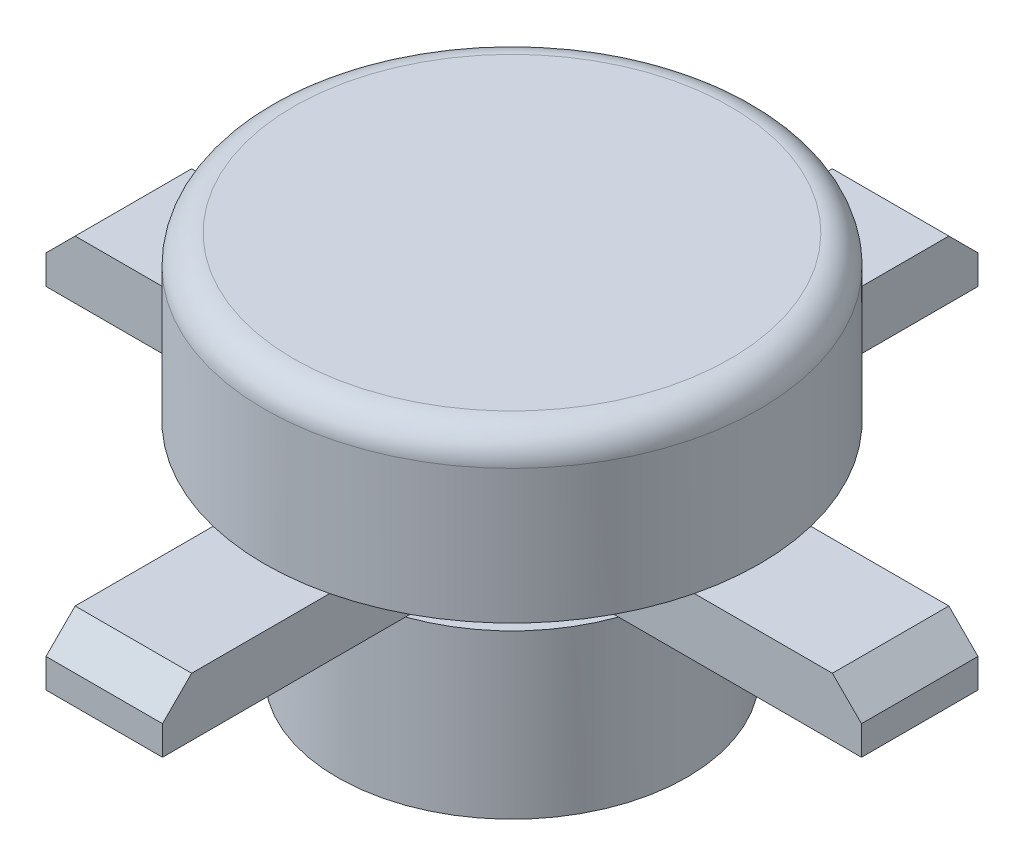
ISO-10303-21;
HEADER;
FILE_DESCRIPTION(('STEP AP214'),'2;1');
FILE_NAME('part.step','',(''),(''),'','','');
FILE_SCHEMA(('AUTOMOTIVE_DESIGN { 1 0 10303 214 1 1 1 1 }'));
ENDSEC;
DATA;
#1=APPLICATION_CONTEXT('core data for automotive mechanical design processes');
#2=APPLICATION_PROTOCOL_DEFINITION('international standard','automotive_design',2000,#1);
#3=PRODUCT_CONTEXT('',#1,'mechanical');
#4=PRODUCT('Part','Part','',(#3));
#5=PRODUCT_RELATED_PRODUCT_CATEGORY('part','',(#4));
#6=PRODUCT_DEFINITION_FORMATION('','',#4);
#7=PRODUCT_DEFINITION_CONTEXT('part definition',#1,'design');
#8=PRODUCT_DEFINITION('design','',#6,#7);
#9=PRODUCT_DEFINITION_SHAPE('','',#8);
#10=(LENGTH_UNIT() NAMED_UNIT(*) SI_UNIT(.MILLI.,.METRE.));
#11=(NAMED_UNIT(*) PLANE_ANGLE_UNIT() SI_UNIT($,.RADIAN.));
#12=(NAMED_UNIT(*) SI_UNIT($,.STERADIAN.) SOLID_ANGLE_UNIT());
#13=UNCERTAINTY_MEASURE_WITH_UNIT(LENGTH_MEASURE(1.E-05),#10,'distance_accuracy_value','');
#14=(GEOMETRIC_REPRESENTATION_CONTEXT(3) GLOBAL_UNCERTAINTY_ASSIGNED_CONTEXT((#13)) GLOBAL_UNIT_ASSIGNED_CONTEXT((#10,
#11,#12)) REPRESENTATION_CONTEXT('',''));
#15=CARTESIAN_POINT('',(0.,0.,0.));
#16=DIRECTION('',(0.,0.,1.));
#17=DIRECTION('',(1.,0.,0.));
#18=AXIS2_PLACEMENT_3D('',#15,#16,#17);
#19=CARTESIAN_POINT('',(0.,-1.,0.));
#20=DIRECTION('',(0.,-1.,0.));
#21=DIRECTION('',(0.,0.,-1.));
#22=AXIS2_PLACEMENT_3D('',#19,#20,#21);
#23=PLANE('',#22);
#24=CARTESIAN_POINT('',(0.,-1.,0.));
#25=DIRECTION('',(0.,-1.,0.));
#26=DIRECTION('',(0.,0.,-1.));
#27=AXIS2_PLACEMENT_3D('',#24,#25,#26);
#28=CIRCLE('',#27,3.);
#29=CARTESIAN_POINT('',(2.82842712474619,-1.,-1.));
#30=VERTEX_POINT('',#29);
#31=CARTESIAN_POINT('',(2.82842712474619,-1.,1.));
#32=VERTEX_POINT('',#31);
#33=EDGE_CURVE('E11',#30,#32,#28,.T.);
#34=ORIENTED_EDGE('',*,*,#33,.F.);
#35=DIRECTION('',(1.,0.,0.));
#36=VECTOR('',#35,1.);
#37=CARTESIAN_POINT('',(-7.,-1.,-1.));
#38=LINE('',#37,#36);
#39=CARTESIAN_POINT('',(7.,-1.,-1.));
#40=VERTEX_POINT('',#39);
#41=EDGE_CURVE('E260',#30,#40,#38,.T.);
#42=ORIENTED_EDGE('',*,*,#41,.T.);
#43=DIRECTION('',(0.,0.,1.));
#44=VECTOR('',#43,1.);
#45=CARTESIAN_POINT('',(7.,-1.,1.));
#46=LINE('',#45,#44);
#47=CARTESIAN_POINT('',(7.,-1.,1.));
#48=VERTEX_POINT('',#47);
#49=EDGE_CURVE('E252',#40,#48,#46,.T.);
#50=ORIENTED_EDGE('',*,*,#49,.T.);
#51=DIRECTION('',(-1.,0.,0.));
#52=VECTOR('',#51,1.);
#53=CARTESIAN_POINT('',(-7.,-1.,1.));
#54=LINE('',#53,#52);
#55=EDGE_CURVE('E250',#48,#32,#54,.T.);
#56=ORIENTED_EDGE('',*,*,#55,.T.);
#57=EDGE_LOOP('',(#34,#42,#50,#56));
#58=FACE_BOUND('',#57,.T.);
#59=ADVANCED_FACE('F33',(#58),#23,.T.);
#60=CARTESIAN_POINT('',(0.999999999999999,-1.,2.82842712474619));
#61=VERTEX_POINT('',#60);
#62=CARTESIAN_POINT('',(-1.,-1.,2.82842712474619));
#63=VERTEX_POINT('',#62);
#64=EDGE_CURVE('E42',#61,#63,#28,.T.);
#65=ORIENTED_EDGE('',*,*,#64,.F.);
#66=DIRECTION('',(0.,0.,1.));
#67=VECTOR('',#66,1.);
#68=CARTESIAN_POINT('',(0.999999999999999,-1.,7.));
#69=LINE('',#68,#67);
#70=CARTESIAN_POINT('',(0.999999999999999,-1.,7.));
#71=VERTEX_POINT('',#70);
#72=EDGE_CURVE('E212',#61,#71,#69,.T.);
#73=ORIENTED_EDGE('',*,*,#72,.T.);
#74=DIRECTION('',(-1.,0.,0.));
#75=VECTOR('',#74,1.);
#76=CARTESIAN_POINT('',(-1.,-1.,7.));
#77=LINE('',#76,#75);
#78=CARTESIAN_POINT('',(-1.,-1.,7.));
#79=VERTEX_POINT('',#78);
#80=EDGE_CURVE('E209',#71,#79,#77,.T.);
#81=ORIENTED_EDGE('',*,*,#80,.T.);
#82=DIRECTION('',(0.,0.,-1.));
#83=VECTOR('',#82,1.);
#84=CARTESIAN_POINT('',(-1.,-1.,7.));
#85=LINE('',#84,#83);
#86=EDGE_CURVE('E457',#79,#63,#85,.T.);
#87=ORIENTED_EDGE('',*,*,#86,.T.);
#88=EDGE_LOOP('',(#65,#73,#81,#87));
#89=FACE_BOUND('',#88,.T.);
#90=ADVANCED_FACE('F482',(#89),#23,.T.);
#91=CARTESIAN_POINT('',(-2.82842712474619,-1.,1.));
#92=VERTEX_POINT('',#91);
#93=CARTESIAN_POINT('',(-2.82842712474619,-1.,-1.));
#94=VERTEX_POINT('',#93);
#95=EDGE_CURVE('E51',#92,#94,#28,.T.);
#96=ORIENTED_EDGE('',*,*,#95,.F.);
#97=CARTESIAN_POINT('',(-7.,-1.,1.));
#98=VERTEX_POINT('',#97);
#99=EDGE_CURVE('E248',#92,#98,#54,.T.);
#100=ORIENTED_EDGE('',*,*,#99,.T.);
#101=DIRECTION('',(0.,0.,-1.));
#102=VECTOR('',#101,1.);
#103=CARTESIAN_POINT('',(-7.,-1.,1.));
#104=LINE('',#103,#102);
#105=CARTESIAN_POINT('',(-7.,-1.,-1.));
#106=VERTEX_POINT('',#105);
#107=EDGE_CURVE('E256',#98,#106,#104,.T.);
#108=ORIENTED_EDGE('',*,*,#107,.T.);
#109=EDGE_CURVE('E265',#106,#94,#38,.T.);
#110=ORIENTED_EDGE('',*,*,#109,.T.);
#111=EDGE_LOOP('',(#96,#100,#108,#110));
#112=FACE_BOUND('',#111,.T.);
#113=ADVANCED_FACE('F450',(#112),#23,.T.);
#114=CARTESIAN_POINT('',(0.,0.,0.));
#115=DIRECTION('',(0.,1.,0.));
#116=DIRECTION('',(0.,0.,1.));
#117=AXIS2_PLACEMENT_3D('',#114,#115,#116);
#118=PLANE('',#117);
#119=DIRECTION('',(0.,0.,1.));
#120=VECTOR('',#119,1.);
#121=CARTESIAN_POINT('',(0.999999999999999,0.,7.));
#122=LINE('',#121,#120);
#123=CARTESIAN_POINT('',(1.,0.,-4.13067791046458));
#124=VERTEX_POINT('',#123);
#125=CARTESIAN_POINT('',(1.,0.,-1.));
#126=VERTEX_POINT('',#125);
#127=EDGE_CURVE('E357',#124,#126,#122,.T.);
#128=ORIENTED_EDGE('',*,*,#127,.F.);
#129=CARTESIAN_POINT('',(0.,0.,0.));
#130=DIRECTION('',(0.,1.,0.));
#131=DIRECTION('',(0.,0.,1.));
#132=AXIS2_PLACEMENT_3D('',#129,#130,#131);
#133=CIRCLE('',#132,4.25);
#134=CARTESIAN_POINT('',(4.13067791046458,0.,-1.));
#135=VERTEX_POINT('',#134);
#136=EDGE_CURVE('E294',#135,#124,#133,.T.);
#137=ORIENTED_EDGE('',*,*,#136,.F.);
#138=DIRECTION('',(1.,0.,0.));
#139=VECTOR('',#138,1.);
#140=CARTESIAN_POINT('',(-7.,0.,-1.));
#141=LINE('',#140,#139);
#142=EDGE_CURVE('E276',#126,#135,#141,.T.);
#143=ORIENTED_EDGE('',*,*,#142,.F.);
#144=EDGE_LOOP('',(#128,#137,#143));
#145=FACE_BOUND('',#144,.T.);
#146=ADVANCED_FACE('F475',(#145),#118,.F.);
#147=DIRECTION('',(0.,0.,-1.));
#148=VECTOR('',#147,1.);
#149=CARTESIAN_POINT('',(-1.,0.,7.));
#150=LINE('',#149,#148);
#151=CARTESIAN_POINT('',(-1.,0.,-1.));
#152=VERTEX_POINT('',#151);
#153=CARTESIAN_POINT('',(-1.,0.,-4.13067791046458));
#154=VERTEX_POINT('',#153);
#155=EDGE_CURVE('E359',#152,#154,#150,.T.);
#156=ORIENTED_EDGE('',*,*,#155,.F.);
#157=CARTESIAN_POINT('',(-4.13067791046458,0.,-1.));
#158=VERTEX_POINT('',#157);
#159=EDGE_CURVE('E277',#158,#152,#141,.T.);
#160=ORIENTED_EDGE('',*,*,#159,.F.);
#161=EDGE_CURVE('E382',#154,#158,#133,.T.);
#162=ORIENTED_EDGE('',*,*,#161,.F.);
#163=EDGE_LOOP('',(#156,#160,#162));
#164=FACE_BOUND('',#163,.T.);
#165=ADVANCED_FACE('F472',(#164),#118,.F.);
#166=CARTESIAN_POINT('',(1.,0.,0.999999999999999));
#167=VERTEX_POINT('',#166);
#168=CARTESIAN_POINT('',(0.999999999999999,0.,4.13067791046458));
#169=VERTEX_POINT('',#168);
#170=EDGE_CURVE('E362',#167,#169,#122,.T.);
#171=ORIENTED_EDGE('',*,*,#170,.F.);
#172=DIRECTION('',(-1.,0.,0.));
#173=VECTOR('',#172,1.);
#174=CARTESIAN_POINT('',(-7.,0.,1.));
#175=LINE('',#174,#173);
#176=CARTESIAN_POINT('',(4.13067791046458,0.,1.));
#177=VERTEX_POINT('',#176);
#178=EDGE_CURVE('E273',#177,#167,#175,.T.);
#179=ORIENTED_EDGE('',*,*,#178,.F.);
#180=EDGE_CURVE('E289',#169,#177,#133,.T.);
#181=ORIENTED_EDGE('',*,*,#180,.F.);
#182=EDGE_LOOP('',(#171,#179,#181));
#183=FACE_BOUND('',#182,.T.);
#184=ADVANCED_FACE('F378',(#183),#118,.F.);
#185=CARTESIAN_POINT('',(-1.,0.,4.13067791046458));
#186=VERTEX_POINT('',#185);
#187=CARTESIAN_POINT('',(-1.,0.,0.999999999999999));
#188=VERTEX_POINT('',#187);
#189=EDGE_CURVE('E436',#186,#188,#150,.T.);
#190=ORIENTED_EDGE('',*,*,#189,.F.);
#191=CARTESIAN_POINT('',(-4.13067791046458,0.,1.));
#192=VERTEX_POINT('',#191);
#193=EDGE_CURVE('E381',#192,#186,#133,.T.);
#194=ORIENTED_EDGE('',*,*,#193,.F.);
#195=EDGE_CURVE('E272',#188,#192,#175,.T.);
#196=ORIENTED_EDGE('',*,*,#195,.F.);
#197=EDGE_LOOP('',(#190,#194,#196));
#198=FACE_BOUND('',#197,.T.);
#199=ADVANCED_FACE('F435',(#198),#118,.F.);
#200=CARTESIAN_POINT('',(-7.,-1.,1.));
#201=DIRECTION('',(0.,0.,-1.));
#202=DIRECTION('',(-1.,0.,0.));
#203=AXIS2_PLACEMENT_3D('',#200,#201,#202);
#204=PLANE('',#203);
#205=DIRECTION('',(0.,1.,0.));
#206=VECTOR('',#205,1.);
#207=CARTESIAN_POINT('',(7.,-1.,1.));
#208=LINE('',#207,#206);
#209=CARTESIAN_POINT('',(7.,-0.500000000000002,1.));
#210=VERTEX_POINT('',#209);
#211=EDGE_CURVE('E286',#48,#210,#208,.T.);
#212=ORIENTED_EDGE('',*,*,#211,.T.);
#213=DIRECTION('',(0.70710678118655,-0.707106781186545,0.));
#214=VECTOR('',#213,1.);
#215=CARTESIAN_POINT('',(7.,-0.500000000000002,1.));
#216=LINE('',#215,#214);
#217=CARTESIAN_POINT('',(6.5,0.,1.));
#218=VERTEX_POINT('',#217);
#219=EDGE_CURVE('E312',#210,#218,#216,.F.);
#220=ORIENTED_EDGE('',*,*,#219,.T.);
#221=EDGE_CURVE('E268',#218,#177,#175,.T.);
#222=ORIENTED_EDGE('',*,*,#221,.T.);
#223=ORIENTED_EDGE('',*,*,#178,.T.);
#224=DIRECTION('',(0.,1.,0.));
#225=VECTOR('',#224,1.);
#226=CARTESIAN_POINT('',(0.999999999999999,-1.,1.));
#227=LINE('',#226,#225);
#228=CARTESIAN_POINT('',(1.,-1.,0.999999999999999));
#229=VERTEX_POINT('',#228);
#230=EDGE_CURVE('E372',#229,#167,#227,.T.);
#231=ORIENTED_EDGE('',*,*,#230,.F.);
#232=EDGE_CURVE('E247',#32,#229,#54,.T.);
#233=ORIENTED_EDGE('',*,*,#232,.F.);
#234=ORIENTED_EDGE('',*,*,#55,.F.);
#235=EDGE_LOOP('',(#212,#220,#222,#223,#231,#233,#234));
#236=FACE_BOUND('',#235,.T.);
#237=ADVANCED_FACE('F404',(#236),#204,.F.);
#238=CARTESIAN_POINT('',(-6.49999999999999,0.,1.));
#239=VERTEX_POINT('',#238);
#240=EDGE_CURVE('E271',#192,#239,#175,.T.);
#241=ORIENTED_EDGE('',*,*,#240,.T.);
#242=DIRECTION('',(0.70710678118655,0.707106781186545,0.));
#243=VECTOR('',#242,1.);
#244=CARTESIAN_POINT('',(-7.,-0.500000000000002,1.));
#245=LINE('',#244,#243);
#246=CARTESIAN_POINT('',(-7.,-0.500000000000002,1.));
#247=VERTEX_POINT('',#246);
#248=EDGE_CURVE('E325',#239,#247,#245,.F.);
#249=ORIENTED_EDGE('',*,*,#248,.T.);
#250=DIRECTION('',(0.,1.,0.));
#251=VECTOR('',#250,1.);
#252=CARTESIAN_POINT('',(-7.,-1.,1.));
#253=LINE('',#252,#251);
#254=EDGE_CURVE('E283',#98,#247,#253,.T.);
#255=ORIENTED_EDGE('',*,*,#254,.F.);
#256=ORIENTED_EDGE('',*,*,#99,.F.);
#257=CARTESIAN_POINT('',(-1.,-1.,1.));
#258=VERTEX_POINT('',#257);
#259=EDGE_CURVE('E244',#258,#92,#54,.T.);
#260=ORIENTED_EDGE('',*,*,#259,.F.);
#261=DIRECTION('',(0.,-1.,0.));
#262=VECTOR('',#261,1.);
#263=CARTESIAN_POINT('',(-1.,-1.,1.));
#264=LINE('',#263,#262);
#265=EDGE_CURVE('E426',#188,#258,#264,.T.);
#266=ORIENTED_EDGE('',*,*,#265,.F.);
#267=ORIENTED_EDGE('',*,*,#195,.T.);
#268=EDGE_LOOP('',(#241,#249,#255,#256,#260,#266,#267));
#269=FACE_BOUND('',#268,.T.);
#270=ADVANCED_FACE('F423',(#269),#204,.F.);
#271=CARTESIAN_POINT('',(-7.,-1.,-1.));
#272=DIRECTION('',(0.,0.,1.));
#273=DIRECTION('',(1.,0.,0.));
#274=AXIS2_PLACEMENT_3D('',#271,#272,#273);
#275=PLANE('',#274);
#276=CARTESIAN_POINT('',(6.5,0.,-1.));
#277=VERTEX_POINT('',#276);
#278=EDGE_CURVE('E270',#135,#277,#141,.T.);
#279=ORIENTED_EDGE('',*,*,#278,.T.);
#280=DIRECTION('',(-0.70710678118655,0.707106781186545,0.));
#281=VECTOR('',#280,1.);
#282=CARTESIAN_POINT('',(7.,-0.500000000000002,-1.));
#283=LINE('',#282,#281);
#284=CARTESIAN_POINT('',(7.,-0.500000000000002,-1.));
#285=VERTEX_POINT('',#284);
#286=EDGE_CURVE('E316',#277,#285,#283,.F.);
#287=ORIENTED_EDGE('',*,*,#286,.T.);
#288=DIRECTION('',(0.,1.,0.));
#289=VECTOR('',#288,1.);
#290=CARTESIAN_POINT('',(7.,-1.,-1.));
#291=LINE('',#290,#289);
#292=EDGE_CURVE('E267',#40,#285,#291,.T.);
#293=ORIENTED_EDGE('',*,*,#292,.F.);
#294=ORIENTED_EDGE('',*,*,#41,.F.);
#295=CARTESIAN_POINT('',(0.999999999999999,-1.,-1.));
#296=VERTEX_POINT('',#295);
#297=EDGE_CURVE('E230',#296,#30,#38,.T.);
#298=ORIENTED_EDGE('',*,*,#297,.F.);
#299=DIRECTION('',(0.,-1.,0.));
#300=VECTOR('',#299,1.);
#301=CARTESIAN_POINT('',(1.,-1.,-1.));
#302=LINE('',#301,#300);
#303=EDGE_CURVE('E217',#126,#296,#302,.T.);
#304=ORIENTED_EDGE('',*,*,#303,.F.);
#305=ORIENTED_EDGE('',*,*,#142,.T.);
#306=EDGE_LOOP('',(#279,#287,#293,#294,#298,#304,#305));
#307=FACE_BOUND('',#306,.T.);
#308=ADVANCED_FACE('F411',(#307),#275,.F.);
#309=DIRECTION('',(0.,1.,0.));
#310=VECTOR('',#309,1.);
#311=CARTESIAN_POINT('',(-7.,-1.,-1.));
#312=LINE('',#311,#310);
#313=CARTESIAN_POINT('',(-7.,-0.500000000000002,-1.));
#314=VERTEX_POINT('',#313);
#315=EDGE_CURVE('E280',#106,#314,#312,.T.);
#316=ORIENTED_EDGE('',*,*,#315,.T.);
#317=DIRECTION('',(-0.70710678118655,-0.707106781186545,0.));
#318=VECTOR('',#317,1.);
#319=CARTESIAN_POINT('',(-7.,-0.500000000000002,-1.));
#320=LINE('',#319,#318);
#321=CARTESIAN_POINT('',(-6.49999999999999,0.,-1.));
#322=VERTEX_POINT('',#321);
#323=EDGE_CURVE('E321',#314,#322,#320,.F.);
#324=ORIENTED_EDGE('',*,*,#323,.T.);
#325=EDGE_CURVE('E274',#322,#158,#141,.T.);
#326=ORIENTED_EDGE('',*,*,#325,.T.);
#327=ORIENTED_EDGE('',*,*,#159,.T.);
#328=DIRECTION('',(0.,1.,0.));
#329=VECTOR('',#328,1.);
#330=CARTESIAN_POINT('',(-1.,-1.,-1.));
#331=LINE('',#330,#329);
#332=CARTESIAN_POINT('',(-1.,-1.,-1.));
#333=VERTEX_POINT('',#332);
#334=EDGE_CURVE('E467',#333,#152,#331,.T.);
#335=ORIENTED_EDGE('',*,*,#334,.F.);
#336=EDGE_CURVE('E264',#94,#333,#38,.T.);
#337=ORIENTED_EDGE('',*,*,#336,.F.);
#338=ORIENTED_EDGE('',*,*,#109,.F.);
#339=EDGE_LOOP('',(#316,#324,#326,#327,#335,#337,#338));
#340=FACE_BOUND('',#339,.T.);
#341=ADVANCED_FACE('F447',(#340),#275,.F.);
#342=CARTESIAN_POINT('',(0.,2.8,0.));
#343=DIRECTION('',(0.,-1.,0.));
#344=DIRECTION('',(0.,0.,-1.));
#345=AXIS2_PLACEMENT_3D('',#342,#343,#344);
#346=CYLINDRICAL_SURFACE('',#345,4.25);
#347=CARTESIAN_POINT('',(0.,2.3,0.));
#348=DIRECTION('',(0.,1.,0.));
#349=DIRECTION('',(0.,0.,1.));
#350=AXIS2_PLACEMENT_3D('',#347,#348,#349);
#351=CIRCLE('',#350,4.25);
#352=CARTESIAN_POINT('',(0.,2.3,4.25));
#353=VERTEX_POINT('',#352);
#354=EDGE_CURVE('E297',#353,#353,#351,.F.);
#355=ORIENTED_EDGE('',*,*,#354,.T.);
#356=EDGE_LOOP('',(#355));
#357=FACE_BOUND('',#356,.T.);
#358=EDGE_CURVE('E290',#177,#135,#133,.T.);
#359=ORIENTED_EDGE('',*,*,#358,.T.);
#360=ORIENTED_EDGE('',*,*,#136,.T.);
#361=CARTESIAN_POINT('',(0.,0.,0.));
#362=DIRECTION('',(0.,-1.,0.));
#363=DIRECTION('',(0.,0.,-1.));
#364=AXIS2_PLACEMENT_3D('',#361,#362,#363);
#365=CIRCLE('',#364,4.25);
#366=EDGE_CURVE('E355',#154,#124,#365,.T.);
#367=ORIENTED_EDGE('',*,*,#366,.F.);
#368=ORIENTED_EDGE('',*,*,#161,.T.);
#369=EDGE_CURVE('E430',#158,#192,#133,.T.);
#370=ORIENTED_EDGE('',*,*,#369,.T.);
#371=ORIENTED_EDGE('',*,*,#193,.T.);
#372=EDGE_CURVE('E385',#169,#186,#365,.T.);
#373=ORIENTED_EDGE('',*,*,#372,.F.);
#374=ORIENTED_EDGE('',*,*,#180,.T.);
#375=EDGE_LOOP('',(#359,#360,#367,#368,#370,#371,#373,#374));
#376=FACE_BOUND('',#375,.T.);
#377=ADVANCED_FACE('F386',(#357,#376),#346,.T.);
#378=CARTESIAN_POINT('',(0.,2.8,0.));
#379=DIRECTION('',(0.,1.,0.));
#380=DIRECTION('',(0.,0.,1.));
#381=AXIS2_PLACEMENT_3D('',#378,#379,#380);
#382=PLANE('',#381);
#383=CARTESIAN_POINT('',(0.,2.8,0.));
#384=DIRECTION('',(0.,1.,0.));
#385=DIRECTION('',(0.,0.,1.));
#386=AXIS2_PLACEMENT_3D('',#383,#384,#385);
#387=CIRCLE('',#386,3.75);
#388=CARTESIAN_POINT('',(0.,2.8,3.75));
#389=VERTEX_POINT('',#388);
#390=EDGE_CURVE('E293',#389,#389,#387,.T.);
#391=ORIENTED_EDGE('',*,*,#390,.T.);
#392=EDGE_LOOP('',(#391));
#393=FACE_BOUND('',#392,.T.);
#394=ADVANCED_FACE('F510',(#393),#382,.T.);
#395=CARTESIAN_POINT('',(0.,2.3,0.));
#396=DIRECTION('',(0.,1.,0.));
#397=DIRECTION('',(0.,0.,1.));
#398=AXIS2_PLACEMENT_3D('',#395,#396,#397);
#399=TOROIDAL_SURFACE('',#398,3.75,0.5);
#400=ORIENTED_EDGE('',*,*,#354,.F.);
#401=EDGE_LOOP('',(#400));
#402=FACE_BOUND('',#401,.T.);
#403=ORIENTED_EDGE('',*,*,#390,.F.);
#404=EDGE_LOOP('',(#403));
#405=FACE_BOUND('',#404,.T.);
#406=ADVANCED_FACE('F512',(#402,#405),#399,.T.);
#407=CARTESIAN_POINT('',(0.,0.,0.));
#408=DIRECTION('',(0.,-1.,0.));
#409=DIRECTION('',(0.,0.,-1.));
#410=AXIS2_PLACEMENT_3D('',#407,#408,#409);
#411=PLANE('',#410);
#412=ORIENTED_EDGE('',*,*,#221,.F.);
#413=DIRECTION('',(0.,0.,-1.));
#414=VECTOR('',#413,1.);
#415=CARTESIAN_POINT('',(6.5,0.,0.));
#416=LINE('',#415,#414);
#417=EDGE_CURVE('E314',#218,#277,#416,.T.);
#418=ORIENTED_EDGE('',*,*,#417,.T.);
#419=ORIENTED_EDGE('',*,*,#278,.F.);
#420=ORIENTED_EDGE('',*,*,#358,.F.);
#421=EDGE_LOOP('',(#412,#418,#419,#420));
#422=FACE_BOUND('',#421,.T.);
#423=ADVANCED_FACE('F418',(#422),#411,.F.);
#424=CARTESIAN_POINT('',(7.,-1.,1.));
#425=DIRECTION('',(-1.,0.,0.));
#426=DIRECTION('',(0.,0.,1.));
#427=AXIS2_PLACEMENT_3D('',#424,#425,#426);
#428=PLANE('',#427);
#429=ORIENTED_EDGE('',*,*,#292,.T.);
#430=DIRECTION('',(0.,0.,1.));
#431=VECTOR('',#430,1.);
#432=CARTESIAN_POINT('',(7.,-0.500000000000002,1.));
#433=LINE('',#432,#431);
#434=EDGE_CURVE('E309',#285,#210,#433,.T.);
#435=ORIENTED_EDGE('',*,*,#434,.T.);
#436=ORIENTED_EDGE('',*,*,#211,.F.);
#437=ORIENTED_EDGE('',*,*,#49,.F.);
#438=EDGE_LOOP('',(#429,#435,#436,#437));
#439=FACE_BOUND('',#438,.T.);
#440=ADVANCED_FACE('F401',(#439),#428,.F.);
#441=CARTESIAN_POINT('',(-7.,-1.,1.));
#442=DIRECTION('',(1.,0.,0.));
#443=DIRECTION('',(0.,0.,-1.));
#444=AXIS2_PLACEMENT_3D('',#441,#442,#443);
#445=PLANE('',#444);
#446=ORIENTED_EDGE('',*,*,#254,.T.);
#447=DIRECTION('',(0.,0.,-1.));
#448=VECTOR('',#447,1.);
#449=CARTESIAN_POINT('',(-7.,-0.500000000000002,1.));
#450=LINE('',#449,#448);
#451=EDGE_CURVE('E318',#247,#314,#450,.T.);
#452=ORIENTED_EDGE('',*,*,#451,.T.);
#453=ORIENTED_EDGE('',*,*,#315,.F.);
#454=ORIENTED_EDGE('',*,*,#107,.F.);
#455=EDGE_LOOP('',(#446,#452,#453,#454));
#456=FACE_BOUND('',#455,.T.);
#457=ADVANCED_FACE('F444',(#456),#445,.F.);
#458=CARTESIAN_POINT('',(-1.,-1.,-2.82842712474619));
#459=VERTEX_POINT('',#458);
#460=CARTESIAN_POINT('',(1.,-1.,-2.82842712474619));
#461=VERTEX_POINT('',#460);
#462=EDGE_CURVE('E202',#459,#461,#28,.T.);
#463=ORIENTED_EDGE('',*,*,#462,.F.);
#464=CARTESIAN_POINT('',(-0.999999999999999,-1.,-7.));
#465=VERTEX_POINT('',#464);
#466=EDGE_CURVE('E455',#459,#465,#85,.T.);
#467=ORIENTED_EDGE('',*,*,#466,.T.);
#468=DIRECTION('',(1.,0.,0.));
#469=VECTOR('',#468,1.);
#470=CARTESIAN_POINT('',(-0.999999999999999,-1.,-7.));
#471=LINE('',#470,#469);
#472=CARTESIAN_POINT('',(1.,-1.,-7.));
#473=VERTEX_POINT('',#472);
#474=EDGE_CURVE('E205',#465,#473,#471,.T.);
#475=ORIENTED_EDGE('',*,*,#474,.T.);
#476=EDGE_CURVE('E198',#473,#461,#69,.T.);
#477=ORIENTED_EDGE('',*,*,#476,.T.);
#478=EDGE_LOOP('',(#463,#467,#475,#477));
#479=FACE_BOUND('',#478,.T.);
#480=ADVANCED_FACE('F200',(#479),#23,.T.);
#481=ORIENTED_EDGE('',*,*,#325,.F.);
#482=DIRECTION('',(0.,0.,1.));
#483=VECTOR('',#482,1.);
#484=CARTESIAN_POINT('',(-6.49999999999999,0.,0.));
#485=LINE('',#484,#483);
#486=EDGE_CURVE('E323',#322,#239,#485,.T.);
#487=ORIENTED_EDGE('',*,*,#486,.T.);
#488=ORIENTED_EDGE('',*,*,#240,.F.);
#489=ORIENTED_EDGE('',*,*,#369,.F.);
#490=EDGE_LOOP('',(#481,#487,#488,#489));
#491=FACE_BOUND('',#490,.T.);
#492=ADVANCED_FACE('F437',(#491),#411,.F.);
#493=CARTESIAN_POINT('',(-0.999999999999999,-1.,-7.));
#494=DIRECTION('',(0.,0.,1.));
#495=DIRECTION('',(1.,0.,0.));
#496=AXIS2_PLACEMENT_3D('',#493,#494,#495);
#497=PLANE('',#496);
#498=DIRECTION('',(0.,1.,0.));
#499=VECTOR('',#498,1.);
#500=CARTESIAN_POINT('',(-0.999999999999999,-1.,-7.));
#501=LINE('',#500,#499);
#502=CARTESIAN_POINT('',(-0.999999999999999,-0.500000000000002,-7.));
#503=VERTEX_POINT('',#502);
#504=EDGE_CURVE('E341',#465,#503,#501,.T.);
#505=ORIENTED_EDGE('',*,*,#504,.T.);
#506=DIRECTION('',(1.,0.,0.));
#507=VECTOR('',#506,1.);
#508=CARTESIAN_POINT('',(-0.999999999999999,-0.500000000000002,-7.));
#509=LINE('',#508,#507);
#510=CARTESIAN_POINT('',(1.,-0.500000000000002,-7.));
#511=VERTEX_POINT('',#510);
#512=EDGE_CURVE('E327',#503,#511,#509,.T.);
#513=ORIENTED_EDGE('',*,*,#512,.T.);
#514=DIRECTION('',(0.,1.,0.));
#515=VECTOR('',#514,1.);
#516=CARTESIAN_POINT('',(1.,-1.,-7.));
#517=LINE('',#516,#515);
#518=EDGE_CURVE('E349',#473,#511,#517,.T.);
#519=ORIENTED_EDGE('',*,*,#518,.F.);
#520=ORIENTED_EDGE('',*,*,#474,.F.);
#521=EDGE_LOOP('',(#505,#513,#519,#520));
#522=FACE_BOUND('',#521,.T.);
#523=ADVANCED_FACE('F347',(#522),#497,.F.);
#524=CARTESIAN_POINT('',(-1.,-1.,7.));
#525=DIRECTION('',(1.,0.,0.));
#526=DIRECTION('',(0.,0.,-1.));
#527=AXIS2_PLACEMENT_3D('',#524,#525,#526);
#528=PLANE('',#527);
#529=CARTESIAN_POINT('',(-0.999999999999999,0.,-6.5));
#530=VERTEX_POINT('',#529);
#531=EDGE_CURVE('E343',#154,#530,#150,.T.);
#532=ORIENTED_EDGE('',*,*,#531,.T.);
#533=DIRECTION('',(0.,0.707106781186545,0.70710678118655));
#534=VECTOR('',#533,1.);
#535=CARTESIAN_POINT('',(-0.999999999999999,-0.500000000000002,-7.));
#536=LINE('',#535,#534);
#537=EDGE_CURVE('E37',#530,#503,#536,.F.);
#538=ORIENTED_EDGE('',*,*,#537,.T.);
#539=ORIENTED_EDGE('',*,*,#504,.F.);
#540=ORIENTED_EDGE('',*,*,#466,.F.);
#541=EDGE_CURVE('E454',#333,#459,#85,.T.);
#542=ORIENTED_EDGE('',*,*,#541,.F.);
#543=ORIENTED_EDGE('',*,*,#334,.T.);
#544=ORIENTED_EDGE('',*,*,#155,.T.);
#545=EDGE_LOOP('',(#532,#538,#539,#540,#542,#543,#544));
#546=FACE_BOUND('',#545,.T.);
#547=ADVANCED_FACE('F340',(#546),#528,.F.);
#548=CARTESIAN_POINT('',(0.999999999999999,-1.,7.));
#549=DIRECTION('',(-1.,0.,0.));
#550=DIRECTION('',(0.,0.,1.));
#551=AXIS2_PLACEMENT_3D('',#548,#549,#550);
#552=PLANE('',#551);
#553=ORIENTED_EDGE('',*,*,#518,.T.);
#554=DIRECTION('',(0.,-0.707106781186545,-0.70710678118655));
#555=VECTOR('',#554,1.);
#556=CARTESIAN_POINT('',(1.,-0.500000000000002,-7.));
#557=LINE('',#556,#555);
#558=CARTESIAN_POINT('',(1.,0.,-6.5));
#559=VERTEX_POINT('',#558);
#560=EDGE_CURVE('E330',#511,#559,#557,.F.);
#561=ORIENTED_EDGE('',*,*,#560,.T.);
#562=EDGE_CURVE('E351',#559,#124,#122,.T.);
#563=ORIENTED_EDGE('',*,*,#562,.T.);
#564=ORIENTED_EDGE('',*,*,#127,.T.);
#565=ORIENTED_EDGE('',*,*,#303,.T.);
#566=EDGE_CURVE('E210',#461,#296,#69,.T.);
#567=ORIENTED_EDGE('',*,*,#566,.F.);
#568=ORIENTED_EDGE('',*,*,#476,.F.);
#569=EDGE_LOOP('',(#553,#561,#563,#564,#565,#567,#568));
#570=FACE_BOUND('',#569,.T.);
#571=ADVANCED_FACE('F215',(#570),#552,.F.);
#572=CARTESIAN_POINT('',(0.,0.,0.));
#573=DIRECTION('',(0.,-1.,0.));
#574=DIRECTION('',(0.,0.,-1.));
#575=AXIS2_PLACEMENT_3D('',#572,#573,#574);
#576=PLANE('',#575);
#577=ORIENTED_EDGE('',*,*,#562,.F.);
#578=DIRECTION('',(-1.,0.,0.));
#579=VECTOR('',#578,1.);
#580=CARTESIAN_POINT('',(0.,0.,-6.5));
#581=LINE('',#580,#579);
#582=EDGE_CURVE('E331',#559,#530,#581,.T.);
#583=ORIENTED_EDGE('',*,*,#582,.T.);
#584=ORIENTED_EDGE('',*,*,#531,.F.);
#585=ORIENTED_EDGE('',*,*,#366,.T.);
#586=EDGE_LOOP('',(#577,#583,#584,#585));
#587=FACE_BOUND('',#586,.T.);
#588=ADVANCED_FACE('F353',(#587),#576,.F.);
#589=CARTESIAN_POINT('',(-1.,0.,6.49999999999999));
#590=VERTEX_POINT('',#589);
#591=EDGE_CURVE('E361',#590,#186,#150,.T.);
#592=ORIENTED_EDGE('',*,*,#591,.F.);
#593=DIRECTION('',(1.,0.,0.));
#594=VECTOR('',#593,1.);
#595=CARTESIAN_POINT('',(0.,0.,6.49999999999999));
#596=LINE('',#595,#594);
#597=CARTESIAN_POINT('',(0.999999999999999,0.,6.49999999999999));
#598=VERTEX_POINT('',#597);
#599=EDGE_CURVE('E305',#590,#598,#596,.T.);
#600=ORIENTED_EDGE('',*,*,#599,.T.);
#601=EDGE_CURVE('E233',#169,#598,#122,.T.);
#602=ORIENTED_EDGE('',*,*,#601,.F.);
#603=ORIENTED_EDGE('',*,*,#372,.T.);
#604=EDGE_LOOP('',(#592,#600,#602,#603));
#605=FACE_BOUND('',#604,.T.);
#606=ADVANCED_FACE('F579',(#605),#576,.F.);
#607=ORIENTED_EDGE('',*,*,#601,.T.);
#608=DIRECTION('',(0.,0.707106781186545,-0.70710678118655));
#609=VECTOR('',#608,1.);
#610=CARTESIAN_POINT('',(0.999999999999999,-0.500000000000002,7.));
#611=LINE('',#610,#609);
#612=CARTESIAN_POINT('',(0.999999999999999,-0.500000000000002,7.));
#613=VERTEX_POINT('',#612);
#614=EDGE_CURVE('E307',#598,#613,#611,.F.);
#615=ORIENTED_EDGE('',*,*,#614,.T.);
#616=DIRECTION('',(0.,1.,0.));
#617=VECTOR('',#616,1.);
#618=CARTESIAN_POINT('',(0.999999999999999,-1.,7.));
#619=LINE('',#618,#617);
#620=EDGE_CURVE('E464',#71,#613,#619,.T.);
#621=ORIENTED_EDGE('',*,*,#620,.F.);
#622=ORIENTED_EDGE('',*,*,#72,.F.);
#623=EDGE_CURVE('E213',#229,#61,#69,.T.);
#624=ORIENTED_EDGE('',*,*,#623,.F.);
#625=ORIENTED_EDGE('',*,*,#230,.T.);
#626=ORIENTED_EDGE('',*,*,#170,.T.);
#627=EDGE_LOOP('',(#607,#615,#621,#622,#624,#625,#626));
#628=FACE_BOUND('',#627,.T.);
#629=ADVANCED_FACE('F370',(#628),#552,.F.);
#630=DIRECTION('',(0.,1.,0.));
#631=VECTOR('',#630,1.);
#632=CARTESIAN_POINT('',(-1.,-1.,7.));
#633=LINE('',#632,#631);
#634=CARTESIAN_POINT('',(-1.,-0.500000000000002,7.));
#635=VERTEX_POINT('',#634);
#636=EDGE_CURVE('E348',#79,#635,#633,.T.);
#637=ORIENTED_EDGE('',*,*,#636,.T.);
#638=DIRECTION('',(0.,-0.707106781186545,0.70710678118655));
#639=VECTOR('',#638,1.);
#640=CARTESIAN_POINT('',(-1.,-0.500000000000002,7.));
#641=LINE('',#640,#639);
#642=EDGE_CURVE('E303',#635,#590,#641,.F.);
#643=ORIENTED_EDGE('',*,*,#642,.T.);
#644=ORIENTED_EDGE('',*,*,#591,.T.);
#645=ORIENTED_EDGE('',*,*,#189,.T.);
#646=ORIENTED_EDGE('',*,*,#265,.T.);
#647=EDGE_CURVE('E59',#63,#258,#85,.T.);
#648=ORIENTED_EDGE('',*,*,#647,.F.);
#649=ORIENTED_EDGE('',*,*,#86,.F.);
#650=EDGE_LOOP('',(#637,#643,#644,#645,#646,#648,#649));
#651=FACE_BOUND('',#650,.T.);
#652=ADVANCED_FACE('F469',(#651),#528,.F.);
#653=CARTESIAN_POINT('',(-1.,-1.,7.));
#654=DIRECTION('',(0.,0.,-1.));
#655=DIRECTION('',(-1.,0.,0.));
#656=AXIS2_PLACEMENT_3D('',#653,#654,#655);
#657=PLANE('',#656);
#658=ORIENTED_EDGE('',*,*,#620,.T.);
#659=DIRECTION('',(-1.,0.,0.));
#660=VECTOR('',#659,1.);
#661=CARTESIAN_POINT('',(-1.,-0.500000000000002,7.));
#662=LINE('',#661,#660);
#663=EDGE_CURVE('E300',#613,#635,#662,.T.);
#664=ORIENTED_EDGE('',*,*,#663,.T.);
#665=ORIENTED_EDGE('',*,*,#636,.F.);
#666=ORIENTED_EDGE('',*,*,#80,.F.);
#667=EDGE_LOOP('',(#658,#664,#665,#666));
#668=FACE_BOUND('',#667,.T.);
#669=ADVANCED_FACE('F530',(#668),#657,.F.);
#670=CARTESIAN_POINT('',(-1.,-0.500000000000002,7.));
#671=DIRECTION('',(0.,-0.70710678118655,-0.707106781186545));
#672=DIRECTION('',(-1.,0.,0.));
#673=AXIS2_PLACEMENT_3D('',#670,#671,#672);
#674=PLANE('',#673);
#675=ORIENTED_EDGE('',*,*,#614,.F.);
#676=ORIENTED_EDGE('',*,*,#599,.F.);
#677=ORIENTED_EDGE('',*,*,#642,.F.);
#678=ORIENTED_EDGE('',*,*,#663,.F.);
#679=EDGE_LOOP('',(#675,#676,#677,#678));
#680=FACE_BOUND('',#679,.T.);
#681=ADVANCED_FACE('F527',(#680),#674,.F.);
#682=CARTESIAN_POINT('',(7.,-0.500000000000002,1.));
#683=DIRECTION('',(-0.707106781186545,-0.70710678118655,0.));
#684=DIRECTION('',(0.,0.,1.));
#685=AXIS2_PLACEMENT_3D('',#682,#683,#684);
#686=PLANE('',#685);
#687=ORIENTED_EDGE('',*,*,#286,.F.);
#688=ORIENTED_EDGE('',*,*,#417,.F.);
#689=ORIENTED_EDGE('',*,*,#219,.F.);
#690=ORIENTED_EDGE('',*,*,#434,.F.);
#691=EDGE_LOOP('',(#687,#688,#689,#690));
#692=FACE_BOUND('',#691,.T.);
#693=ADVANCED_FACE('F414',(#692),#686,.F.);
#694=CARTESIAN_POINT('',(-7.,-0.500000000000002,1.));
#695=DIRECTION('',(0.707106781186545,-0.70710678118655,0.));
#696=DIRECTION('',(0.,0.,-1.));
#697=AXIS2_PLACEMENT_3D('',#694,#695,#696);
#698=PLANE('',#697);
#699=ORIENTED_EDGE('',*,*,#248,.F.);
#700=ORIENTED_EDGE('',*,*,#486,.F.);
#701=ORIENTED_EDGE('',*,*,#323,.F.);
#702=ORIENTED_EDGE('',*,*,#451,.F.);
#703=EDGE_LOOP('',(#699,#700,#701,#702));
#704=FACE_BOUND('',#703,.T.);
#705=ADVANCED_FACE('F440',(#704),#698,.F.);
#706=CARTESIAN_POINT('',(-0.999999999999999,-0.500000000000002,-7.));
#707=DIRECTION('',(0.,-0.70710678118655,0.707106781186545));
#708=DIRECTION('',(1.,0.,0.));
#709=AXIS2_PLACEMENT_3D('',#706,#707,#708);
#710=PLANE('',#709);
#711=ORIENTED_EDGE('',*,*,#537,.F.);
#712=ORIENTED_EDGE('',*,*,#582,.F.);
#713=ORIENTED_EDGE('',*,*,#560,.F.);
#714=ORIENTED_EDGE('',*,*,#512,.F.);
#715=EDGE_LOOP('',(#711,#712,#713,#714));
#716=FACE_BOUND('',#715,.T.);
#717=ADVANCED_FACE('F35',(#716),#710,.F.);
#718=CARTESIAN_POINT('',(0.,-1.,0.));
#719=DIRECTION('',(0.,-1.,0.));
#720=DIRECTION('',(0.,0.,-1.));
#721=AXIS2_PLACEMENT_3D('',#718,#719,#720);
#722=PLANE('',#721);
#723=EDGE_CURVE('E228',#94,#459,#28,.T.);
#724=ORIENTED_EDGE('',*,*,#723,.F.);
#725=ORIENTED_EDGE('',*,*,#336,.T.);
#726=ORIENTED_EDGE('',*,*,#541,.T.);
#727=EDGE_LOOP('',(#724,#725,#726));
#728=FACE_BOUND('',#727,.T.);
#729=ADVANCED_FACE('F453',(#728),#722,.F.);
#730=EDGE_CURVE('E226',#461,#30,#28,.T.);
#731=ORIENTED_EDGE('',*,*,#730,.F.);
#732=ORIENTED_EDGE('',*,*,#566,.T.);
#733=ORIENTED_EDGE('',*,*,#297,.T.);
#734=EDGE_LOOP('',(#731,#732,#733));
#735=FACE_BOUND('',#734,.T.);
#736=ADVANCED_FACE('F229',(#735),#722,.F.);
#737=EDGE_CURVE('E44',#32,#61,#28,.T.);
#738=ORIENTED_EDGE('',*,*,#737,.F.);
#739=ORIENTED_EDGE('',*,*,#232,.T.);
#740=ORIENTED_EDGE('',*,*,#623,.T.);
#741=EDGE_LOOP('',(#738,#739,#740));
#742=FACE_BOUND('',#741,.T.);
#743=ADVANCED_FACE('F408',(#742),#722,.F.);
#744=EDGE_CURVE('E236',#63,#92,#28,.T.);
#745=ORIENTED_EDGE('',*,*,#744,.F.);
#746=ORIENTED_EDGE('',*,*,#647,.T.);
#747=ORIENTED_EDGE('',*,*,#259,.T.);
#748=EDGE_LOOP('',(#745,#746,#747));
#749=FACE_BOUND('',#748,.T.);
#750=ADVANCED_FACE('F242',(#749),#722,.F.);
#751=CARTESIAN_POINT('',(0.,-3.8,0.));
#752=DIRECTION('',(0.,1.,0.));
#753=DIRECTION('',(0.,0.,1.));
#754=AXIS2_PLACEMENT_3D('',#751,#752,#753);
#755=CYLINDRICAL_SURFACE('',#754,3.);
#756=CARTESIAN_POINT('',(0.,-3.8,0.));
#757=DIRECTION('',(0.,-1.,0.));
#758=DIRECTION('',(0.,0.,-1.));
#759=AXIS2_PLACEMENT_3D('',#756,#757,#758);
#760=CIRCLE('',#759,3.);
#761=CARTESIAN_POINT('',(0.,-3.8,-3.));
#762=VERTEX_POINT('',#761);
#763=EDGE_CURVE('E231',#762,#762,#760,.T.);
#764=ORIENTED_EDGE('',*,*,#763,.F.);
#765=EDGE_LOOP('',(#764));
#766=FACE_BOUND('',#765,.T.);
#767=ORIENTED_EDGE('',*,*,#730,.T.);
#768=ORIENTED_EDGE('',*,*,#33,.T.);
#769=ORIENTED_EDGE('',*,*,#737,.T.);
#770=ORIENTED_EDGE('',*,*,#64,.T.);
#771=ORIENTED_EDGE('',*,*,#744,.T.);
#772=ORIENTED_EDGE('',*,*,#95,.T.);
#773=ORIENTED_EDGE('',*,*,#723,.T.);
#774=ORIENTED_EDGE('',*,*,#462,.T.);
#775=EDGE_LOOP('',(#767,#768,#769,#770,#771,#772,#773,#774));
#776=FACE_BOUND('',#775,.T.);
#777=ADVANCED_FACE('F225',(#766,#776),#755,.T.);
#778=CARTESIAN_POINT('',(0.,-3.8,0.));
#779=DIRECTION('',(0.,-1.,0.));
#780=DIRECTION('',(0.,0.,-1.));
#781=AXIS2_PLACEMENT_3D('',#778,#779,#780);
#782=PLANE('',#781);
#783=ORIENTED_EDGE('',*,*,#763,.T.);
#784=EDGE_LOOP('',(#783));
#785=FACE_BOUND('',#784,.T.);
#786=ADVANCED_FACE('F552',(#785),#782,.T.);
#787=CLOSED_SHELL('',(#59,#90,#113,#146,#165,#184,#199,#237,#270,#308,#341,#377,#394,#406,#423,
#440,#457,#480,#492,#523,#547,#571,#588,#606,#629,#652,#669,#681,#693,#705,#717,#729,#736,#743,
#750,#777,#786));
#788=MANIFOLD_SOLID_BREP('B2',#787);
#789=ADVANCED_BREP_SHAPE_REPRESENTATION('',(#18,#788),#14);
#790=SHAPE_DEFINITION_REPRESENTATION(#9,#789);
ENDSEC;
END-ISO-10303-21;
